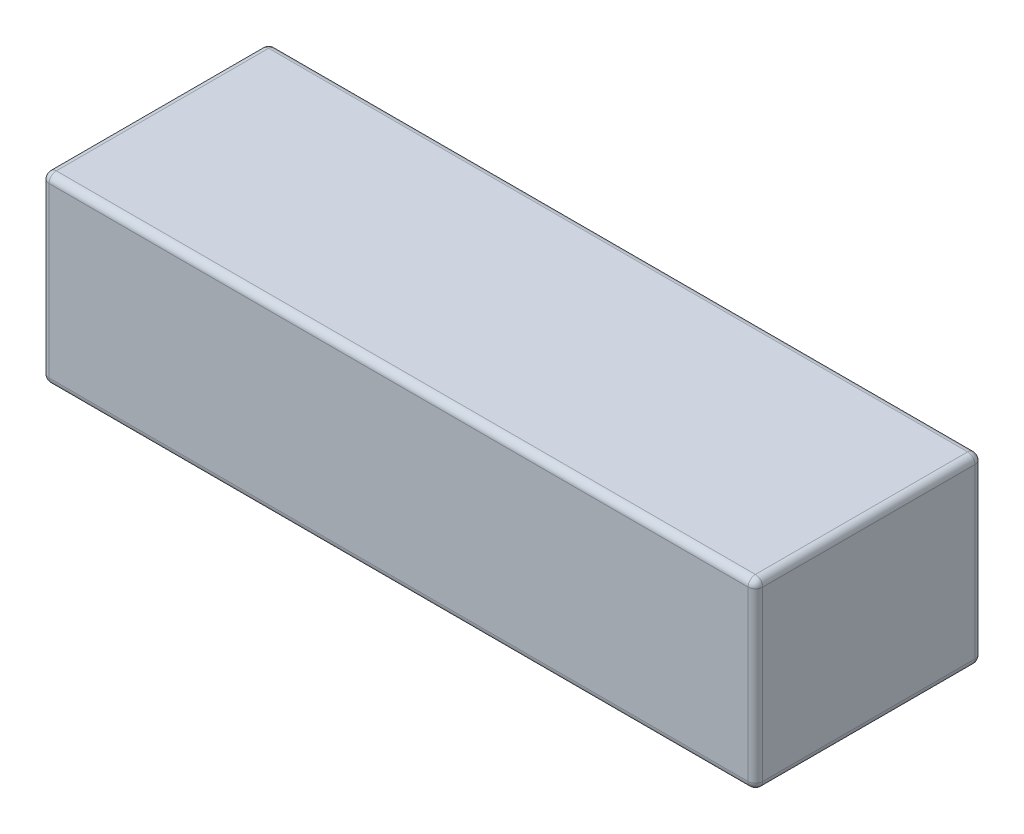
ISO-10303-21;
HEADER;
FILE_DESCRIPTION(('STEP AP214'),'2;1');
FILE_NAME('part.step','',(''),(''),'','','');
FILE_SCHEMA(('AUTOMOTIVE_DESIGN { 1 0 10303 214 1 1 1 1 }'));
ENDSEC;
DATA;
#1=APPLICATION_CONTEXT('core data for automotive mechanical design processes');
#2=APPLICATION_PROTOCOL_DEFINITION('international standard','automotive_design',2000,#1);
#3=PRODUCT_CONTEXT('',#1,'mechanical');
#4=PRODUCT('Part','Part','',(#3));
#5=PRODUCT_RELATED_PRODUCT_CATEGORY('part','',(#4));
#6=PRODUCT_DEFINITION_FORMATION('','',#4);
#7=PRODUCT_DEFINITION_CONTEXT('part definition',#1,'design');
#8=PRODUCT_DEFINITION('design','',#6,#7);
#9=PRODUCT_DEFINITION_SHAPE('','',#8);
#10=(LENGTH_UNIT() NAMED_UNIT(*) SI_UNIT(.MILLI.,.METRE.));
#11=(NAMED_UNIT(*) PLANE_ANGLE_UNIT() SI_UNIT($,.RADIAN.));
#12=(NAMED_UNIT(*) SI_UNIT($,.STERADIAN.) SOLID_ANGLE_UNIT());
#13=UNCERTAINTY_MEASURE_WITH_UNIT(LENGTH_MEASURE(1.E-05),#10,'distance_accuracy_value','');
#14=(GEOMETRIC_REPRESENTATION_CONTEXT(3) GLOBAL_UNCERTAINTY_ASSIGNED_CONTEXT((#13)) GLOBAL_UNIT_ASSIGNED_CONTEXT((#10,
#11,#12)) REPRESENTATION_CONTEXT('',''));
#15=CARTESIAN_POINT('',(0.,0.,0.));
#16=DIRECTION('',(0.,0.,1.));
#17=DIRECTION('',(1.,0.,0.));
#18=AXIS2_PLACEMENT_3D('',#15,#16,#17);
#19=CARTESIAN_POINT('',(-123.825,63.5,-39.37));
#20=DIRECTION('',(1.,0.,0.));
#21=DIRECTION('',(0.,0.,-1.));
#22=AXIS2_PLACEMENT_3D('',#19,#20,#21);
#23=PLANE('',#22);
#24=DIRECTION('',(0.,0.,1.));
#25=VECTOR('',#24,1.);
#26=CARTESIAN_POINT('',(-123.825,60.96,-39.37));
#27=LINE('',#26,#25);
#28=CARTESIAN_POINT('',(-123.825,60.96,36.83));
#29=VERTEX_POINT('',#28);
#30=CARTESIAN_POINT('',(-123.825,60.96,-36.83));
#31=VERTEX_POINT('',#30);
#32=EDGE_CURVE('E219',#29,#31,#27,.F.);
#33=ORIENTED_EDGE('',*,*,#32,.T.);
#34=DIRECTION('',(0.,-1.,0.));
#35=VECTOR('',#34,1.);
#36=CARTESIAN_POINT('',(-123.825,63.5,-36.83));
#37=LINE('',#36,#35);
#38=CARTESIAN_POINT('',(-123.825,2.54,-36.83));
#39=VERTEX_POINT('',#38);
#40=EDGE_CURVE('E222',#31,#39,#37,.T.);
#41=ORIENTED_EDGE('',*,*,#40,.T.);
#42=DIRECTION('',(0.,0.,1.));
#43=VECTOR('',#42,1.);
#44=CARTESIAN_POINT('',(-123.825,2.54,39.37));
#45=LINE('',#44,#43);
#46=CARTESIAN_POINT('',(-123.825,2.54,36.83));
#47=VERTEX_POINT('',#46);
#48=EDGE_CURVE('E216',#39,#47,#45,.T.);
#49=ORIENTED_EDGE('',*,*,#48,.T.);
#50=DIRECTION('',(0.,-1.,0.));
#51=VECTOR('',#50,1.);
#52=CARTESIAN_POINT('',(-123.825,63.5,36.83));
#53=LINE('',#52,#51);
#54=EDGE_CURVE('E213',#47,#29,#53,.F.);
#55=ORIENTED_EDGE('',*,*,#54,.T.);
#56=EDGE_LOOP('',(#33,#41,#49,#55));
#57=FACE_BOUND('',#56,.T.);
#58=ADVANCED_FACE('F43',(#57),#23,.F.);
#59=CARTESIAN_POINT('',(123.825,63.5,39.37));
#60=DIRECTION('',(0.,0.,-1.));
#61=DIRECTION('',(-1.,0.,0.));
#62=AXIS2_PLACEMENT_3D('',#59,#60,#61);
#63=PLANE('',#62);
#64=DIRECTION('',(1.,0.,0.));
#65=VECTOR('',#64,1.);
#66=CARTESIAN_POINT('',(123.825,60.96,39.37));
#67=LINE('',#66,#65);
#68=CARTESIAN_POINT('',(121.285,60.96,39.37));
#69=VERTEX_POINT('',#68);
#70=CARTESIAN_POINT('',(-121.285,60.96,39.37));
#71=VERTEX_POINT('',#70);
#72=EDGE_CURVE('E53',#69,#71,#67,.F.);
#73=ORIENTED_EDGE('',*,*,#72,.T.);
#74=DIRECTION('',(0.,-1.,0.));
#75=VECTOR('',#74,1.);
#76=CARTESIAN_POINT('',(-121.285,63.5,39.37));
#77=LINE('',#76,#75);
#78=CARTESIAN_POINT('',(-121.285,2.54,39.37));
#79=VERTEX_POINT('',#78);
#80=EDGE_CURVE('E11',#71,#79,#77,.T.);
#81=ORIENTED_EDGE('',*,*,#80,.T.);
#82=DIRECTION('',(1.,0.,0.));
#83=VECTOR('',#82,1.);
#84=CARTESIAN_POINT('',(123.825,2.54,39.37));
#85=LINE('',#84,#83);
#86=CARTESIAN_POINT('',(121.285,2.54,39.37));
#87=VERTEX_POINT('',#86);
#88=EDGE_CURVE('E226',#79,#87,#85,.T.);
#89=ORIENTED_EDGE('',*,*,#88,.T.);
#90=DIRECTION('',(0.,-1.,0.));
#91=VECTOR('',#90,1.);
#92=CARTESIAN_POINT('',(121.285,63.5,39.37));
#93=LINE('',#92,#91);
#94=EDGE_CURVE('E64',#87,#69,#93,.F.);
#95=ORIENTED_EDGE('',*,*,#94,.T.);
#96=EDGE_LOOP('',(#73,#81,#89,#95));
#97=FACE_BOUND('',#96,.T.);
#98=ADVANCED_FACE('F353',(#97),#63,.F.);
#99=CARTESIAN_POINT('',(123.825,63.5,-39.37));
#100=DIRECTION('',(-1.,0.,0.));
#101=DIRECTION('',(0.,0.,1.));
#102=AXIS2_PLACEMENT_3D('',#99,#100,#101);
#103=PLANE('',#102);
#104=DIRECTION('',(0.,0.,-1.));
#105=VECTOR('',#104,1.);
#106=CARTESIAN_POINT('',(123.825,2.54,-39.37));
#107=LINE('',#106,#105);
#108=CARTESIAN_POINT('',(123.825,2.54,36.83));
#109=VERTEX_POINT('',#108);
#110=CARTESIAN_POINT('',(123.825,2.54,-36.83));
#111=VERTEX_POINT('',#110);
#112=EDGE_CURVE('E193',#109,#111,#107,.T.);
#113=ORIENTED_EDGE('',*,*,#112,.T.);
#114=DIRECTION('',(0.,-1.,0.));
#115=VECTOR('',#114,1.);
#116=CARTESIAN_POINT('',(123.825,63.5,-36.83));
#117=LINE('',#116,#115);
#118=CARTESIAN_POINT('',(123.825,60.96,-36.83));
#119=VERTEX_POINT('',#118);
#120=EDGE_CURVE('E196',#111,#119,#117,.F.);
#121=ORIENTED_EDGE('',*,*,#120,.T.);
#122=DIRECTION('',(0.,0.,-1.));
#123=VECTOR('',#122,1.);
#124=CARTESIAN_POINT('',(123.825,60.96,-39.37));
#125=LINE('',#124,#123);
#126=CARTESIAN_POINT('',(123.825,60.96,36.83));
#127=VERTEX_POINT('',#126);
#128=EDGE_CURVE('E190',#119,#127,#125,.F.);
#129=ORIENTED_EDGE('',*,*,#128,.T.);
#130=DIRECTION('',(0.,-1.,0.));
#131=VECTOR('',#130,1.);
#132=CARTESIAN_POINT('',(123.825,63.5,36.83));
#133=LINE('',#132,#131);
#134=EDGE_CURVE('E187',#127,#109,#133,.T.);
#135=ORIENTED_EDGE('',*,*,#134,.T.);
#136=EDGE_LOOP('',(#113,#121,#129,#135));
#137=FACE_BOUND('',#136,.T.);
#138=ADVANCED_FACE('F325',(#137),#103,.F.);
#139=CARTESIAN_POINT('',(123.825,63.5,-39.37));
#140=DIRECTION('',(0.,0.,1.));
#141=DIRECTION('',(1.,0.,0.));
#142=AXIS2_PLACEMENT_3D('',#139,#140,#141);
#143=PLANE('',#142);
#144=DIRECTION('',(0.,-1.,0.));
#145=VECTOR('',#144,1.);
#146=CARTESIAN_POINT('',(121.285,63.5,-39.37));
#147=LINE('',#146,#145);
#148=CARTESIAN_POINT('',(121.285,60.96,-39.37));
#149=VERTEX_POINT('',#148);
#150=CARTESIAN_POINT('',(121.285,2.54,-39.37));
#151=VERTEX_POINT('',#150);
#152=EDGE_CURVE('E168',#149,#151,#147,.T.);
#153=ORIENTED_EDGE('',*,*,#152,.T.);
#154=DIRECTION('',(-1.,0.,0.));
#155=VECTOR('',#154,1.);
#156=CARTESIAN_POINT('',(-123.825,2.54,-39.37));
#157=LINE('',#156,#155);
#158=CARTESIAN_POINT('',(-121.285,2.54,-39.37));
#159=VERTEX_POINT('',#158);
#160=EDGE_CURVE('E137',#151,#159,#157,.T.);
#161=ORIENTED_EDGE('',*,*,#160,.T.);
#162=DIRECTION('',(0.,-1.,0.));
#163=VECTOR('',#162,1.);
#164=CARTESIAN_POINT('',(-121.285,63.5,-39.37));
#165=LINE('',#164,#163);
#166=CARTESIAN_POINT('',(-121.285,60.96,-39.37));
#167=VERTEX_POINT('',#166);
#168=EDGE_CURVE('E157',#159,#167,#165,.F.);
#169=ORIENTED_EDGE('',*,*,#168,.T.);
#170=DIRECTION('',(-1.,0.,0.));
#171=VECTOR('',#170,1.);
#172=CARTESIAN_POINT('',(123.825,60.96,-39.37));
#173=LINE('',#172,#171);
#174=EDGE_CURVE('E164',#167,#149,#173,.F.);
#175=ORIENTED_EDGE('',*,*,#174,.T.);
#176=EDGE_LOOP('',(#153,#161,#169,#175));
#177=FACE_BOUND('',#176,.T.);
#178=ADVANCED_FACE('F166',(#177),#143,.F.);
#179=CARTESIAN_POINT('',(0.,63.5,0.));
#180=DIRECTION('',(0.,-1.,0.));
#181=DIRECTION('',(0.,0.,-1.));
#182=AXIS2_PLACEMENT_3D('',#179,#180,#181);
#183=PLANE('',#182);
#184=DIRECTION('',(0.,0.,-1.));
#185=VECTOR('',#184,1.);
#186=CARTESIAN_POINT('',(121.285,63.5,0.));
#187=LINE('',#186,#185);
#188=CARTESIAN_POINT('',(121.285,63.5,36.83));
#189=VERTEX_POINT('',#188);
#190=CARTESIAN_POINT('',(121.285,63.5,-36.83));
#191=VERTEX_POINT('',#190);
#192=EDGE_CURVE('E206',#189,#191,#187,.T.);
#193=ORIENTED_EDGE('',*,*,#192,.T.);
#194=DIRECTION('',(-1.,0.,0.));
#195=VECTOR('',#194,1.);
#196=CARTESIAN_POINT('',(0.,63.5,-36.83));
#197=LINE('',#196,#195);
#198=CARTESIAN_POINT('',(-121.285,63.5,-36.83));
#199=VERTEX_POINT('',#198);
#200=EDGE_CURVE('E209',#191,#199,#197,.T.);
#201=ORIENTED_EDGE('',*,*,#200,.T.);
#202=DIRECTION('',(0.,0.,1.));
#203=VECTOR('',#202,1.);
#204=CARTESIAN_POINT('',(-121.285,63.5,0.));
#205=LINE('',#204,#203);
#206=CARTESIAN_POINT('',(-121.285,63.5,36.83));
#207=VERTEX_POINT('',#206);
#208=EDGE_CURVE('E203',#199,#207,#205,.T.);
#209=ORIENTED_EDGE('',*,*,#208,.T.);
#210=DIRECTION('',(1.,0.,0.));
#211=VECTOR('',#210,1.);
#212=CARTESIAN_POINT('',(0.,63.5,36.83));
#213=LINE('',#212,#211);
#214=EDGE_CURVE('E200',#207,#189,#213,.T.);
#215=ORIENTED_EDGE('',*,*,#214,.T.);
#216=EDGE_LOOP('',(#193,#201,#209,#215));
#217=FACE_BOUND('',#216,.T.);
#218=ADVANCED_FACE('F334',(#217),#183,.F.);
#219=CARTESIAN_POINT('',(0.,0.,0.));
#220=DIRECTION('',(0.,-1.,0.));
#221=DIRECTION('',(0.,0.,-1.));
#222=AXIS2_PLACEMENT_3D('',#219,#220,#221);
#223=PLANE('',#222);
#224=DIRECTION('',(0.,0.,1.));
#225=VECTOR('',#224,1.);
#226=CARTESIAN_POINT('',(-121.285,0.,-39.37));
#227=LINE('',#226,#225);
#228=CARTESIAN_POINT('',(-121.285,0.,36.83));
#229=VERTEX_POINT('',#228);
#230=CARTESIAN_POINT('',(-121.285,0.,-36.83));
#231=VERTEX_POINT('',#230);
#232=EDGE_CURVE('E175',#229,#231,#227,.F.);
#233=ORIENTED_EDGE('',*,*,#232,.T.);
#234=DIRECTION('',(-1.,0.,0.));
#235=VECTOR('',#234,1.);
#236=CARTESIAN_POINT('',(123.825,0.,-36.83));
#237=LINE('',#236,#235);
#238=CARTESIAN_POINT('',(121.285,0.,-36.83));
#239=VERTEX_POINT('',#238);
#240=EDGE_CURVE('E139',#231,#239,#237,.F.);
#241=ORIENTED_EDGE('',*,*,#240,.T.);
#242=DIRECTION('',(0.,0.,-1.));
#243=VECTOR('',#242,1.);
#244=CARTESIAN_POINT('',(121.285,0.,39.37));
#245=LINE('',#244,#243);
#246=CARTESIAN_POINT('',(121.285,0.,36.83));
#247=VERTEX_POINT('',#246);
#248=EDGE_CURVE('E182',#239,#247,#245,.F.);
#249=ORIENTED_EDGE('',*,*,#248,.T.);
#250=DIRECTION('',(1.,0.,0.));
#251=VECTOR('',#250,1.);
#252=CARTESIAN_POINT('',(-123.825,0.,36.83));
#253=LINE('',#252,#251);
#254=EDGE_CURVE('E171',#247,#229,#253,.F.);
#255=ORIENTED_EDGE('',*,*,#254,.T.);
#256=EDGE_LOOP('',(#233,#241,#249,#255));
#257=FACE_BOUND('',#256,.T.);
#258=ADVANCED_FACE('F413',(#257),#223,.T.);
#259=CARTESIAN_POINT('',(0.,60.96,36.83));
#260=DIRECTION('',(1.,0.,0.));
#261=DIRECTION('',(0.,0.,-1.));
#262=AXIS2_PLACEMENT_3D('',#259,#260,#261);
#263=CYLINDRICAL_SURFACE('',#262,2.54);
#264=CARTESIAN_POINT('',(121.285,60.96,36.83));
#265=DIRECTION('',(1.,0.,0.));
#266=DIRECTION('',(0.,0.,-1.));
#267=AXIS2_PLACEMENT_3D('',#264,#265,#266);
#268=CIRCLE('',#267,2.54);
#269=EDGE_CURVE('E47',#189,#69,#268,.T.);
#270=ORIENTED_EDGE('',*,*,#269,.F.);
#271=ORIENTED_EDGE('',*,*,#214,.F.);
#272=CARTESIAN_POINT('',(-121.285,60.96,36.83));
#273=DIRECTION('',(-1.,0.,0.));
#274=DIRECTION('',(0.,0.,1.));
#275=AXIS2_PLACEMENT_3D('',#272,#273,#274);
#276=CIRCLE('',#275,2.54);
#277=EDGE_CURVE('E302',#71,#207,#276,.T.);
#278=ORIENTED_EDGE('',*,*,#277,.F.);
#279=ORIENTED_EDGE('',*,*,#72,.F.);
#280=EDGE_LOOP('',(#270,#271,#278,#279));
#281=FACE_BOUND('',#280,.T.);
#282=ADVANCED_FACE('F45',(#281),#263,.T.);
#283=CARTESIAN_POINT('',(121.285,60.96,36.83));
#284=DIRECTION('',(0.,0.,1.));
#285=DIRECTION('',(1.,0.,0.));
#286=AXIS2_PLACEMENT_3D('',#283,#284,#285);
#287=SPHERICAL_SURFACE('',#286,2.54);
#288=CARTESIAN_POINT('',(121.285,60.96,36.83));
#289=DIRECTION('',(0.,0.,1.));
#290=DIRECTION('',(0.,-1.,0.));
#291=AXIS2_PLACEMENT_3D('',#288,#289,#290);
#292=CIRCLE('',#291,2.54);
#293=EDGE_CURVE('E295',#189,#127,#292,.F.);
#294=ORIENTED_EDGE('',*,*,#293,.F.);
#295=ORIENTED_EDGE('',*,*,#269,.T.);
#296=CARTESIAN_POINT('',(121.285,60.96,36.83));
#297=DIRECTION('',(0.,1.,0.));
#298=DIRECTION('',(0.,0.,1.));
#299=AXIS2_PLACEMENT_3D('',#296,#297,#298);
#300=CIRCLE('',#299,2.54);
#301=EDGE_CURVE('E299',#127,#69,#300,.F.);
#302=ORIENTED_EDGE('',*,*,#301,.F.);
#303=EDGE_LOOP('',(#294,#295,#302));
#304=FACE_BOUND('',#303,.T.);
#305=ADVANCED_FACE('F314',(#304),#287,.T.);
#306=CARTESIAN_POINT('',(-121.285,60.96,36.83));
#307=DIRECTION('',(0.,1.,0.));
#308=DIRECTION('',(-1.,0.,0.));
#309=AXIS2_PLACEMENT_3D('',#306,#307,#308);
#310=SPHERICAL_SURFACE('',#309,2.54);
#311=CARTESIAN_POINT('',(-121.285,60.96,36.83));
#312=DIRECTION('',(0.,1.,0.));
#313=DIRECTION('',(0.,0.,1.));
#314=AXIS2_PLACEMENT_3D('',#311,#312,#313);
#315=CIRCLE('',#314,2.54);
#316=EDGE_CURVE('E287',#71,#29,#315,.F.);
#317=ORIENTED_EDGE('',*,*,#316,.F.);
#318=ORIENTED_EDGE('',*,*,#277,.T.);
#319=CARTESIAN_POINT('',(-121.285,60.96,36.83));
#320=DIRECTION('',(0.,0.,1.));
#321=DIRECTION('',(1.,0.,0.));
#322=AXIS2_PLACEMENT_3D('',#319,#320,#321);
#323=CIRCLE('',#322,2.54);
#324=EDGE_CURVE('E291',#29,#207,#323,.F.);
#325=ORIENTED_EDGE('',*,*,#324,.F.);
#326=EDGE_LOOP('',(#317,#318,#325));
#327=FACE_BOUND('',#326,.T.);
#328=ADVANCED_FACE('F347',(#327),#310,.T.);
#329=CARTESIAN_POINT('',(121.285,63.5,36.83));
#330=DIRECTION('',(0.,-1.,0.));
#331=DIRECTION('',(0.,0.,-1.));
#332=AXIS2_PLACEMENT_3D('',#329,#330,#331);
#333=CYLINDRICAL_SURFACE('',#332,2.54);
#334=ORIENTED_EDGE('',*,*,#301,.T.);
#335=ORIENTED_EDGE('',*,*,#94,.F.);
#336=CARTESIAN_POINT('',(121.285,2.54,36.83));
#337=DIRECTION('',(0.,-1.,0.));
#338=DIRECTION('',(0.,0.,-1.));
#339=AXIS2_PLACEMENT_3D('',#336,#337,#338);
#340=CIRCLE('',#339,2.54);
#341=EDGE_CURVE('E279',#109,#87,#340,.T.);
#342=ORIENTED_EDGE('',*,*,#341,.F.);
#343=ORIENTED_EDGE('',*,*,#134,.F.);
#344=EDGE_LOOP('',(#334,#335,#342,#343));
#345=FACE_BOUND('',#344,.T.);
#346=ADVANCED_FACE('F320',(#345),#333,.T.);
#347=CARTESIAN_POINT('',(121.285,60.96,0.));
#348=DIRECTION('',(0.,0.,-1.));
#349=DIRECTION('',(-1.,0.,0.));
#350=AXIS2_PLACEMENT_3D('',#347,#348,#349);
#351=CYLINDRICAL_SURFACE('',#350,2.54);
#352=ORIENTED_EDGE('',*,*,#293,.T.);
#353=ORIENTED_EDGE('',*,*,#128,.F.);
#354=CARTESIAN_POINT('',(121.285,60.96,-36.83));
#355=DIRECTION('',(0.,0.,-1.));
#356=DIRECTION('',(-1.,0.,0.));
#357=AXIS2_PLACEMENT_3D('',#354,#355,#356);
#358=CIRCLE('',#357,2.54);
#359=EDGE_CURVE('E275',#191,#119,#358,.T.);
#360=ORIENTED_EDGE('',*,*,#359,.F.);
#361=ORIENTED_EDGE('',*,*,#192,.F.);
#362=EDGE_LOOP('',(#352,#353,#360,#361));
#363=FACE_BOUND('',#362,.T.);
#364=ADVANCED_FACE('F331',(#363),#351,.T.);
#365=CARTESIAN_POINT('',(0.,60.96,-36.83));
#366=DIRECTION('',(-1.,0.,0.));
#367=DIRECTION('',(0.,0.,1.));
#368=AXIS2_PLACEMENT_3D('',#365,#366,#367);
#369=CYLINDRICAL_SURFACE('',#368,2.54);
#370=CARTESIAN_POINT('',(-121.285,60.96,-36.83));
#371=DIRECTION('',(-1.,0.,0.));
#372=DIRECTION('',(0.,0.,1.));
#373=AXIS2_PLACEMENT_3D('',#370,#371,#372);
#374=CIRCLE('',#373,2.54);
#375=EDGE_CURVE('E267',#199,#167,#374,.T.);
#376=ORIENTED_EDGE('',*,*,#375,.F.);
#377=ORIENTED_EDGE('',*,*,#200,.F.);
#378=CARTESIAN_POINT('',(121.285,60.96,-36.83));
#379=DIRECTION('',(1.,0.,0.));
#380=DIRECTION('',(0.,0.,-1.));
#381=AXIS2_PLACEMENT_3D('',#378,#379,#380);
#382=CIRCLE('',#381,2.54);
#383=EDGE_CURVE('E271',#149,#191,#382,.T.);
#384=ORIENTED_EDGE('',*,*,#383,.F.);
#385=ORIENTED_EDGE('',*,*,#174,.F.);
#386=EDGE_LOOP('',(#376,#377,#384,#385));
#387=FACE_BOUND('',#386,.T.);
#388=ADVANCED_FACE('F338',(#387),#369,.T.);
#389=CARTESIAN_POINT('',(-121.285,60.96,0.));
#390=DIRECTION('',(0.,0.,1.));
#391=DIRECTION('',(1.,0.,0.));
#392=AXIS2_PLACEMENT_3D('',#389,#390,#391);
#393=CYLINDRICAL_SURFACE('',#392,2.54);
#394=ORIENTED_EDGE('',*,*,#324,.T.);
#395=ORIENTED_EDGE('',*,*,#208,.F.);
#396=CARTESIAN_POINT('',(-121.285,60.96,-36.83));
#397=DIRECTION('',(0.,0.,-1.));
#398=DIRECTION('',(-1.,0.,0.));
#399=AXIS2_PLACEMENT_3D('',#396,#397,#398);
#400=CIRCLE('',#399,2.54);
#401=EDGE_CURVE('E264',#31,#199,#400,.T.);
#402=ORIENTED_EDGE('',*,*,#401,.F.);
#403=ORIENTED_EDGE('',*,*,#32,.F.);
#404=EDGE_LOOP('',(#394,#395,#402,#403));
#405=FACE_BOUND('',#404,.T.);
#406=ADVANCED_FACE('F344',(#405),#393,.T.);
#407=CARTESIAN_POINT('',(-121.285,63.5,36.83));
#408=DIRECTION('',(0.,-1.,0.));
#409=DIRECTION('',(0.,0.,-1.));
#410=AXIS2_PLACEMENT_3D('',#407,#408,#409);
#411=CYLINDRICAL_SURFACE('',#410,2.54);
#412=ORIENTED_EDGE('',*,*,#316,.T.);
#413=ORIENTED_EDGE('',*,*,#54,.F.);
#414=CARTESIAN_POINT('',(-121.285,2.54,36.83));
#415=DIRECTION('',(0.,-1.,0.));
#416=DIRECTION('',(0.,0.,-1.));
#417=AXIS2_PLACEMENT_3D('',#414,#415,#416);
#418=CIRCLE('',#417,2.54);
#419=EDGE_CURVE('E260',#79,#47,#418,.T.);
#420=ORIENTED_EDGE('',*,*,#419,.F.);
#421=ORIENTED_EDGE('',*,*,#80,.F.);
#422=EDGE_LOOP('',(#412,#413,#420,#421));
#423=FACE_BOUND('',#422,.T.);
#424=ADVANCED_FACE('F351',(#423),#411,.T.);
#425=CARTESIAN_POINT('',(123.825,2.54,36.83));
#426=DIRECTION('',(-1.,0.,0.));
#427=DIRECTION('',(0.,0.,1.));
#428=AXIS2_PLACEMENT_3D('',#425,#426,#427);
#429=CYLINDRICAL_SURFACE('',#428,2.54);
#430=CARTESIAN_POINT('',(121.285,2.54,36.83));
#431=DIRECTION('',(1.,0.,0.));
#432=DIRECTION('',(0.,0.,-1.));
#433=AXIS2_PLACEMENT_3D('',#430,#431,#432);
#434=CIRCLE('',#433,2.54);
#435=EDGE_CURVE('E283',#87,#247,#434,.T.);
#436=ORIENTED_EDGE('',*,*,#435,.F.);
#437=ORIENTED_EDGE('',*,*,#88,.F.);
#438=CARTESIAN_POINT('',(-121.285,2.54,36.83));
#439=DIRECTION('',(-1.,0.,0.));
#440=DIRECTION('',(0.,0.,1.));
#441=AXIS2_PLACEMENT_3D('',#438,#439,#440);
#442=CIRCLE('',#441,2.54);
#443=EDGE_CURVE('E257',#229,#79,#442,.T.);
#444=ORIENTED_EDGE('',*,*,#443,.F.);
#445=ORIENTED_EDGE('',*,*,#254,.F.);
#446=EDGE_LOOP('',(#436,#437,#444,#445));
#447=FACE_BOUND('',#446,.T.);
#448=ADVANCED_FACE('F356',(#447),#429,.T.);
#449=CARTESIAN_POINT('',(121.285,2.54,36.83));
#450=DIRECTION('',(0.,0.,1.));
#451=DIRECTION('',(0.,-1.,0.));
#452=AXIS2_PLACEMENT_3D('',#449,#450,#451);
#453=SPHERICAL_SURFACE('',#452,2.54);
#454=ORIENTED_EDGE('',*,*,#341,.T.);
#455=ORIENTED_EDGE('',*,*,#435,.T.);
#456=CARTESIAN_POINT('',(121.285,2.54,36.83));
#457=DIRECTION('',(0.,0.,1.));
#458=DIRECTION('',(1.,0.,0.));
#459=AXIS2_PLACEMENT_3D('',#456,#457,#458);
#460=CIRCLE('',#459,2.54);
#461=EDGE_CURVE('E253',#109,#247,#460,.F.);
#462=ORIENTED_EDGE('',*,*,#461,.F.);
#463=EDGE_LOOP('',(#454,#455,#462));
#464=FACE_BOUND('',#463,.T.);
#465=ADVANCED_FACE('F360',(#464),#453,.T.);
#466=CARTESIAN_POINT('',(121.285,60.96,-36.83));
#467=DIRECTION('',(0.,1.,0.));
#468=DIRECTION('',(0.,0.,1.));
#469=AXIS2_PLACEMENT_3D('',#466,#467,#468);
#470=SPHERICAL_SURFACE('',#469,2.54);
#471=ORIENTED_EDGE('',*,*,#383,.T.);
#472=ORIENTED_EDGE('',*,*,#359,.T.);
#473=CARTESIAN_POINT('',(121.285,60.96,-36.83));
#474=DIRECTION('',(0.,1.,0.));
#475=DIRECTION('',(0.,0.,1.));
#476=AXIS2_PLACEMENT_3D('',#473,#474,#475);
#477=CIRCLE('',#476,2.54);
#478=EDGE_CURVE('E250',#149,#119,#477,.F.);
#479=ORIENTED_EDGE('',*,*,#478,.F.);
#480=EDGE_LOOP('',(#471,#472,#479));
#481=FACE_BOUND('',#480,.T.);
#482=ADVANCED_FACE('F371',(#481),#470,.T.);
#483=CARTESIAN_POINT('',(-121.285,60.96,-36.83));
#484=DIRECTION('',(0.,1.,0.));
#485=DIRECTION('',(-1.,0.,0.));
#486=AXIS2_PLACEMENT_3D('',#483,#484,#485);
#487=SPHERICAL_SURFACE('',#486,2.54);
#488=ORIENTED_EDGE('',*,*,#401,.T.);
#489=ORIENTED_EDGE('',*,*,#375,.T.);
#490=CARTESIAN_POINT('',(-121.285,60.96,-36.83));
#491=DIRECTION('',(0.,1.,0.));
#492=DIRECTION('',(0.,0.,1.));
#493=AXIS2_PLACEMENT_3D('',#490,#491,#492);
#494=CIRCLE('',#493,2.54);
#495=EDGE_CURVE('E160',#31,#167,#494,.F.);
#496=ORIENTED_EDGE('',*,*,#495,.F.);
#497=EDGE_LOOP('',(#488,#489,#496));
#498=FACE_BOUND('',#497,.T.);
#499=ADVANCED_FACE('F373',(#498),#487,.T.);
#500=CARTESIAN_POINT('',(-121.285,2.54,36.83));
#501=DIRECTION('',(0.,0.,1.));
#502=DIRECTION('',(1.,0.,0.));
#503=AXIS2_PLACEMENT_3D('',#500,#501,#502);
#504=SPHERICAL_SURFACE('',#503,2.54);
#505=ORIENTED_EDGE('',*,*,#443,.T.);
#506=ORIENTED_EDGE('',*,*,#419,.T.);
#507=CARTESIAN_POINT('',(-121.285,2.54,36.83));
#508=DIRECTION('',(0.,0.,1.));
#509=DIRECTION('',(1.,0.,0.));
#510=AXIS2_PLACEMENT_3D('',#507,#508,#509);
#511=CIRCLE('',#510,2.54);
#512=EDGE_CURVE('E244',#229,#47,#511,.F.);
#513=ORIENTED_EDGE('',*,*,#512,.F.);
#514=EDGE_LOOP('',(#505,#506,#513));
#515=FACE_BOUND('',#514,.T.);
#516=ADVANCED_FACE('F379',(#515),#504,.T.);
#517=CARTESIAN_POINT('',(121.285,2.54,-39.37));
#518=DIRECTION('',(0.,0.,1.));
#519=DIRECTION('',(1.,0.,0.));
#520=AXIS2_PLACEMENT_3D('',#517,#518,#519);
#521=CYLINDRICAL_SURFACE('',#520,2.54);
#522=ORIENTED_EDGE('',*,*,#461,.T.);
#523=ORIENTED_EDGE('',*,*,#248,.F.);
#524=CARTESIAN_POINT('',(121.285,2.54,-36.83));
#525=DIRECTION('',(0.,0.,-1.));
#526=DIRECTION('',(-1.,0.,0.));
#527=AXIS2_PLACEMENT_3D('',#524,#525,#526);
#528=CIRCLE('',#527,2.54);
#529=EDGE_CURVE('E240',#111,#239,#528,.T.);
#530=ORIENTED_EDGE('',*,*,#529,.F.);
#531=ORIENTED_EDGE('',*,*,#112,.F.);
#532=EDGE_LOOP('',(#522,#523,#530,#531));
#533=FACE_BOUND('',#532,.T.);
#534=ADVANCED_FACE('F364',(#533),#521,.T.);
#535=CARTESIAN_POINT('',(121.285,63.5,-36.83));
#536=DIRECTION('',(0.,-1.,0.));
#537=DIRECTION('',(0.,0.,-1.));
#538=AXIS2_PLACEMENT_3D('',#535,#536,#537);
#539=CYLINDRICAL_SURFACE('',#538,2.54);
#540=ORIENTED_EDGE('',*,*,#478,.T.);
#541=ORIENTED_EDGE('',*,*,#120,.F.);
#542=CARTESIAN_POINT('',(121.285,2.54,-36.83));
#543=DIRECTION('',(0.,-1.,0.));
#544=DIRECTION('',(0.,0.,-1.));
#545=AXIS2_PLACEMENT_3D('',#542,#543,#544);
#546=CIRCLE('',#545,2.54);
#547=EDGE_CURVE('E154',#151,#111,#546,.T.);
#548=ORIENTED_EDGE('',*,*,#547,.F.);
#549=ORIENTED_EDGE('',*,*,#152,.F.);
#550=EDGE_LOOP('',(#540,#541,#548,#549));
#551=FACE_BOUND('',#550,.T.);
#552=ADVANCED_FACE('F369',(#551),#539,.T.);
#553=CARTESIAN_POINT('',(-121.285,63.5,-36.83));
#554=DIRECTION('',(0.,-1.,0.));
#555=DIRECTION('',(0.,0.,-1.));
#556=AXIS2_PLACEMENT_3D('',#553,#554,#555);
#557=CYLINDRICAL_SURFACE('',#556,2.54);
#558=ORIENTED_EDGE('',*,*,#495,.T.);
#559=ORIENTED_EDGE('',*,*,#168,.F.);
#560=CARTESIAN_POINT('',(-121.285,2.54,-36.83));
#561=DIRECTION('',(0.,-1.,0.));
#562=DIRECTION('',(0.,0.,-1.));
#563=AXIS2_PLACEMENT_3D('',#560,#561,#562);
#564=CIRCLE('',#563,2.54);
#565=EDGE_CURVE('E145',#39,#159,#564,.T.);
#566=ORIENTED_EDGE('',*,*,#565,.F.);
#567=ORIENTED_EDGE('',*,*,#40,.F.);
#568=EDGE_LOOP('',(#558,#559,#566,#567));
#569=FACE_BOUND('',#568,.T.);
#570=ADVANCED_FACE('F158',(#569),#557,.T.);
#571=CARTESIAN_POINT('',(-121.285,2.54,-39.37));
#572=DIRECTION('',(0.,0.,-1.));
#573=DIRECTION('',(-1.,0.,0.));
#574=AXIS2_PLACEMENT_3D('',#571,#572,#573);
#575=CYLINDRICAL_SURFACE('',#574,2.54);
#576=ORIENTED_EDGE('',*,*,#512,.T.);
#577=ORIENTED_EDGE('',*,*,#48,.F.);
#578=CARTESIAN_POINT('',(-121.285,2.54,-36.83));
#579=DIRECTION('',(0.,0.,-1.));
#580=DIRECTION('',(-1.,0.,0.));
#581=AXIS2_PLACEMENT_3D('',#578,#579,#580);
#582=CIRCLE('',#581,2.54);
#583=EDGE_CURVE('E149',#231,#39,#582,.T.);
#584=ORIENTED_EDGE('',*,*,#583,.F.);
#585=ORIENTED_EDGE('',*,*,#232,.F.);
#586=EDGE_LOOP('',(#576,#577,#584,#585));
#587=FACE_BOUND('',#586,.T.);
#588=ADVANCED_FACE('F397',(#587),#575,.T.);
#589=CARTESIAN_POINT('',(121.285,2.54,-36.83));
#590=DIRECTION('',(1.,0.,0.));
#591=DIRECTION('',(0.,1.,0.));
#592=AXIS2_PLACEMENT_3D('',#589,#590,#591);
#593=SPHERICAL_SURFACE('',#592,2.54);
#594=ORIENTED_EDGE('',*,*,#547,.T.);
#595=ORIENTED_EDGE('',*,*,#529,.T.);
#596=CARTESIAN_POINT('',(121.285,2.54,-36.83));
#597=DIRECTION('',(1.,0.,0.));
#598=DIRECTION('',(0.,0.,-1.));
#599=AXIS2_PLACEMENT_3D('',#596,#597,#598);
#600=CIRCLE('',#599,2.54);
#601=EDGE_CURVE('E142',#151,#239,#600,.F.);
#602=ORIENTED_EDGE('',*,*,#601,.F.);
#603=EDGE_LOOP('',(#594,#595,#602));
#604=FACE_BOUND('',#603,.T.);
#605=ADVANCED_FACE('F367',(#604),#593,.T.);
#606=CARTESIAN_POINT('',(-121.285,2.54,-36.83));
#607=DIRECTION('',(-1.,0.,0.));
#608=DIRECTION('',(0.,-1.,0.));
#609=AXIS2_PLACEMENT_3D('',#606,#607,#608);
#610=SPHERICAL_SURFACE('',#609,2.54);
#611=ORIENTED_EDGE('',*,*,#583,.T.);
#612=ORIENTED_EDGE('',*,*,#565,.T.);
#613=CARTESIAN_POINT('',(-121.285,2.54,-36.83));
#614=DIRECTION('',(-1.,0.,0.));
#615=DIRECTION('',(0.,0.,1.));
#616=AXIS2_PLACEMENT_3D('',#613,#614,#615);
#617=CIRCLE('',#616,2.54);
#618=EDGE_CURVE('E133',#231,#159,#617,.F.);
#619=ORIENTED_EDGE('',*,*,#618,.F.);
#620=EDGE_LOOP('',(#611,#612,#619));
#621=FACE_BOUND('',#620,.T.);
#622=ADVANCED_FACE('F147',(#621),#610,.T.);
#623=CARTESIAN_POINT('',(123.825,2.54,-36.83));
#624=DIRECTION('',(1.,0.,0.));
#625=DIRECTION('',(0.,0.,-1.));
#626=AXIS2_PLACEMENT_3D('',#623,#624,#625);
#627=CYLINDRICAL_SURFACE('',#626,2.54);
#628=ORIENTED_EDGE('',*,*,#601,.T.);
#629=ORIENTED_EDGE('',*,*,#240,.F.);
#630=ORIENTED_EDGE('',*,*,#618,.T.);
#631=ORIENTED_EDGE('',*,*,#160,.F.);
#632=EDGE_LOOP('',(#628,#629,#630,#631));
#633=FACE_BOUND('',#632,.T.);
#634=ADVANCED_FACE('F135',(#633),#627,.T.);
#635=CLOSED_SHELL('',(#58,#98,#138,#178,#218,#258,#282,#305,#328,#346,#364,#388,#406,#424,#448,
#465,#482,#499,#516,#534,#552,#570,#588,#605,#622,#634));
#636=MANIFOLD_SOLID_BREP('B2',#635);
#637=ADVANCED_BREP_SHAPE_REPRESENTATION('',(#18,#636),#14);
#638=SHAPE_DEFINITION_REPRESENTATION(#9,#637);
ENDSEC;
END-ISO-10303-21;
